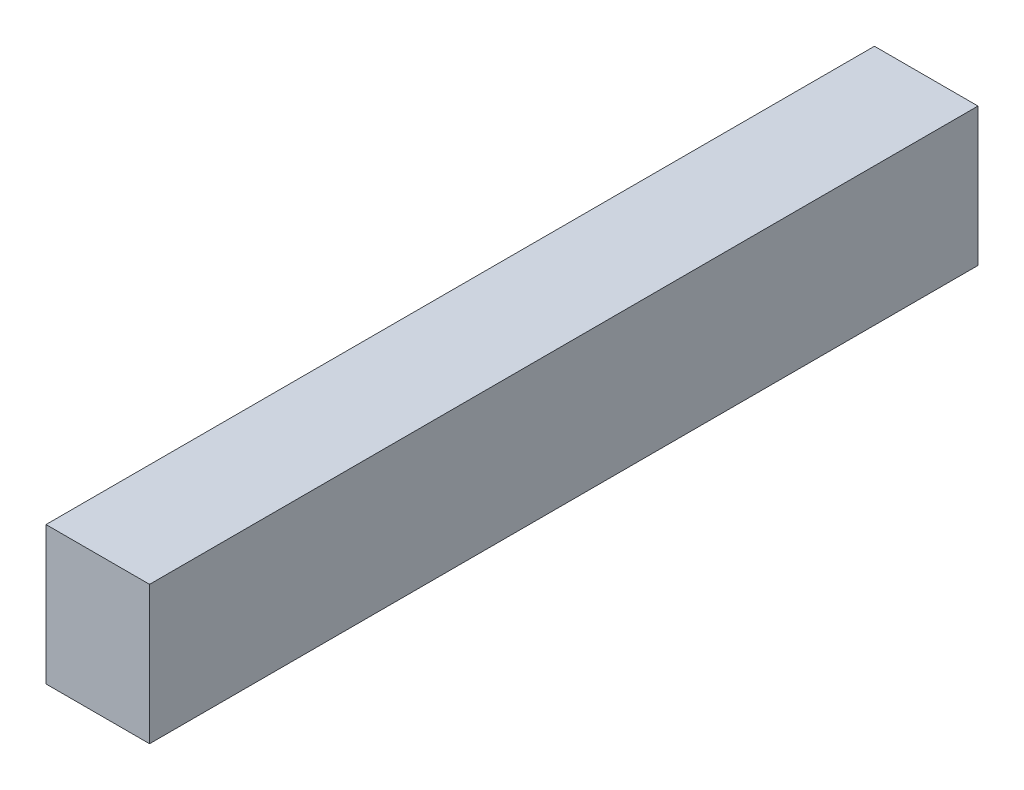
ISO-10303-21;
HEADER;
FILE_DESCRIPTION(('STEP AP214'),'2;1');
FILE_NAME('part.step','',(''),(''),'','','');
FILE_SCHEMA(('AUTOMOTIVE_DESIGN { 1 0 10303 214 1 1 1 1 }'));
ENDSEC;
DATA;
#1=APPLICATION_CONTEXT('core data for automotive mechanical design processes');
#2=APPLICATION_PROTOCOL_DEFINITION('international standard','automotive_design',2000,#1);
#3=PRODUCT_CONTEXT('',#1,'mechanical');
#4=PRODUCT('Part','Part','',(#3));
#5=PRODUCT_RELATED_PRODUCT_CATEGORY('part','',(#4));
#6=PRODUCT_DEFINITION_FORMATION('','',#4);
#7=PRODUCT_DEFINITION_CONTEXT('part definition',#1,'design');
#8=PRODUCT_DEFINITION('design','',#6,#7);
#9=PRODUCT_DEFINITION_SHAPE('','',#8);
#10=(LENGTH_UNIT() NAMED_UNIT(*) SI_UNIT(.MILLI.,.METRE.));
#11=(NAMED_UNIT(*) PLANE_ANGLE_UNIT() SI_UNIT($,.RADIAN.));
#12=(NAMED_UNIT(*) SI_UNIT($,.STERADIAN.) SOLID_ANGLE_UNIT());
#13=UNCERTAINTY_MEASURE_WITH_UNIT(LENGTH_MEASURE(1.E-05),#10,'distance_accuracy_value','');
#14=(GEOMETRIC_REPRESENTATION_CONTEXT(3) GLOBAL_UNCERTAINTY_ASSIGNED_CONTEXT((#13)) GLOBAL_UNIT_ASSIGNED_CONTEXT((#10,
#11,#12)) REPRESENTATION_CONTEXT('',''));
#15=CARTESIAN_POINT('',(0.,0.,0.));
#16=DIRECTION('',(0.,0.,1.));
#17=DIRECTION('',(1.,0.,0.));
#18=AXIS2_PLACEMENT_3D('',#15,#16,#17);
#19=CARTESIAN_POINT('',(-4.20220588235294,5.04264705882352,76.2));
#20=DIRECTION('',(1.,0.,0.));
#21=DIRECTION('',(0.,1.,0.));
#22=AXIS2_PLACEMENT_3D('',#19,#20,#21);
#23=PLANE('',#22);
#24=DIRECTION('',(0.,-1.,0.));
#25=VECTOR('',#24,1.);
#26=CARTESIAN_POINT('',(-4.20220588235294,5.04264705882352,0.));
#27=LINE('',#26,#25);
#28=CARTESIAN_POINT('',(-4.20220588235294,5.04264705882352,0.));
#29=VERTEX_POINT('',#28);
#30=CARTESIAN_POINT('',(-4.20220588235294,-7.65735294117648,0.));
#31=VERTEX_POINT('',#30);
#32=EDGE_CURVE('E99',#29,#31,#27,.T.);
#33=ORIENTED_EDGE('',*,*,#32,.T.);
#34=DIRECTION('',(0.,0.,-1.));
#35=VECTOR('',#34,1.);
#36=CARTESIAN_POINT('',(-4.20220588235294,-7.65735294117648,76.2));
#37=LINE('',#36,#35);
#38=CARTESIAN_POINT('',(-4.20220588235294,-7.65735294117648,76.2));
#39=VERTEX_POINT('',#38);
#40=EDGE_CURVE('E11',#39,#31,#37,.T.);
#41=ORIENTED_EDGE('',*,*,#40,.F.);
#42=DIRECTION('',(0.,-1.,0.));
#43=VECTOR('',#42,1.);
#44=CARTESIAN_POINT('',(-4.20220588235294,5.04264705882352,76.2));
#45=LINE('',#44,#43);
#46=CARTESIAN_POINT('',(-4.20220588235294,5.04264705882352,76.2));
#47=VERTEX_POINT('',#46);
#48=EDGE_CURVE('E87',#47,#39,#45,.T.);
#49=ORIENTED_EDGE('',*,*,#48,.F.);
#50=DIRECTION('',(0.,0.,-1.));
#51=VECTOR('',#50,1.);
#52=CARTESIAN_POINT('',(-4.20220588235294,5.04264705882352,76.2));
#53=LINE('',#52,#51);
#54=EDGE_CURVE('E95',#47,#29,#53,.T.);
#55=ORIENTED_EDGE('',*,*,#54,.T.);
#56=EDGE_LOOP('',(#33,#41,#49,#55));
#57=FACE_BOUND('',#56,.T.);
#58=ADVANCED_FACE('F36',(#57),#23,.F.);
#59=CARTESIAN_POINT('',(-4.20220588235294,-7.65735294117648,76.2));
#60=DIRECTION('',(0.,1.,0.));
#61=DIRECTION('',(0.,0.,1.));
#62=AXIS2_PLACEMENT_3D('',#59,#60,#61);
#63=PLANE('',#62);
#64=DIRECTION('',(1.,0.,0.));
#65=VECTOR('',#64,1.);
#66=CARTESIAN_POINT('',(-4.20220588235294,-7.65735294117648,0.));
#67=LINE('',#66,#65);
#68=CARTESIAN_POINT('',(5.32279411764706,-7.65735294117648,0.));
#69=VERTEX_POINT('',#68);
#70=EDGE_CURVE('E91',#31,#69,#67,.T.);
#71=ORIENTED_EDGE('',*,*,#70,.T.);
#72=DIRECTION('',(0.,0.,-1.));
#73=VECTOR('',#72,1.);
#74=CARTESIAN_POINT('',(5.32279411764706,-7.65735294117648,76.2));
#75=LINE('',#74,#73);
#76=CARTESIAN_POINT('',(5.32279411764706,-7.65735294117648,76.2));
#77=VERTEX_POINT('',#76);
#78=EDGE_CURVE('E44',#77,#69,#75,.T.);
#79=ORIENTED_EDGE('',*,*,#78,.F.);
#80=DIRECTION('',(1.,0.,0.));
#81=VECTOR('',#80,1.);
#82=CARTESIAN_POINT('',(-4.20220588235294,-7.65735294117648,76.2));
#83=LINE('',#82,#81);
#84=EDGE_CURVE('E82',#39,#77,#83,.T.);
#85=ORIENTED_EDGE('',*,*,#84,.F.);
#86=ORIENTED_EDGE('',*,*,#40,.T.);
#87=EDGE_LOOP('',(#71,#79,#85,#86));
#88=FACE_BOUND('',#87,.T.);
#89=ADVANCED_FACE('F90',(#88),#63,.F.);
#90=CARTESIAN_POINT('',(5.32279411764706,5.04264705882352,76.2));
#91=DIRECTION('',(-1.,0.,0.));
#92=DIRECTION('',(0.,-1.,0.));
#93=AXIS2_PLACEMENT_3D('',#90,#91,#92);
#94=PLANE('',#93);
#95=DIRECTION('',(0.,1.,0.));
#96=VECTOR('',#95,1.);
#97=CARTESIAN_POINT('',(5.32279411764706,5.04264705882352,0.));
#98=LINE('',#97,#96);
#99=CARTESIAN_POINT('',(5.32279411764706,5.04264705882352,0.));
#100=VERTEX_POINT('',#99);
#101=EDGE_CURVE('E69',#69,#100,#98,.T.);
#102=ORIENTED_EDGE('',*,*,#101,.T.);
#103=DIRECTION('',(0.,0.,-1.));
#104=VECTOR('',#103,1.);
#105=CARTESIAN_POINT('',(5.32279411764706,5.04264705882352,76.2));
#106=LINE('',#105,#104);
#107=CARTESIAN_POINT('',(5.32279411764706,5.04264705882352,76.2));
#108=VERTEX_POINT('',#107);
#109=EDGE_CURVE('E92',#108,#100,#106,.T.);
#110=ORIENTED_EDGE('',*,*,#109,.F.);
#111=DIRECTION('',(0.,1.,0.));
#112=VECTOR('',#111,1.);
#113=CARTESIAN_POINT('',(5.32279411764706,5.04264705882352,76.2));
#114=LINE('',#113,#112);
#115=EDGE_CURVE('E85',#77,#108,#114,.T.);
#116=ORIENTED_EDGE('',*,*,#115,.F.);
#117=ORIENTED_EDGE('',*,*,#78,.T.);
#118=EDGE_LOOP('',(#102,#110,#116,#117));
#119=FACE_BOUND('',#118,.T.);
#120=ADVANCED_FACE('F93',(#119),#94,.F.);
#121=CARTESIAN_POINT('',(-4.20220588235294,5.04264705882352,76.2));
#122=DIRECTION('',(0.,-1.,0.));
#123=DIRECTION('',(0.,0.,-1.));
#124=AXIS2_PLACEMENT_3D('',#121,#122,#123);
#125=PLANE('',#124);
#126=DIRECTION('',(-1.,0.,0.));
#127=VECTOR('',#126,1.);
#128=CARTESIAN_POINT('',(-4.20220588235294,5.04264705882352,0.));
#129=LINE('',#128,#127);
#130=EDGE_CURVE('E75',#100,#29,#129,.T.);
#131=ORIENTED_EDGE('',*,*,#130,.T.);
#132=ORIENTED_EDGE('',*,*,#54,.F.);
#133=DIRECTION('',(-1.,0.,0.));
#134=VECTOR('',#133,1.);
#135=CARTESIAN_POINT('',(-4.20220588235294,5.04264705882352,76.2));
#136=LINE('',#135,#134);
#137=EDGE_CURVE('E52',#108,#47,#136,.T.);
#138=ORIENTED_EDGE('',*,*,#137,.F.);
#139=ORIENTED_EDGE('',*,*,#109,.T.);
#140=EDGE_LOOP('',(#131,#132,#138,#139));
#141=FACE_BOUND('',#140,.T.);
#142=ADVANCED_FACE('F106',(#141),#125,.F.);
#143=CARTESIAN_POINT('',(0.,0.,76.2));
#144=DIRECTION('',(0.,0.,1.));
#145=DIRECTION('',(1.,0.,0.));
#146=AXIS2_PLACEMENT_3D('',#143,#144,#145);
#147=PLANE('',#146);
#148=ORIENTED_EDGE('',*,*,#48,.T.);
#149=ORIENTED_EDGE('',*,*,#84,.T.);
#150=ORIENTED_EDGE('',*,*,#115,.T.);
#151=ORIENTED_EDGE('',*,*,#137,.T.);
#152=EDGE_LOOP('',(#148,#149,#150,#151));
#153=FACE_BOUND('',#152,.T.);
#154=ADVANCED_FACE('F83',(#153),#147,.T.);
#155=CARTESIAN_POINT('',(0.,0.,0.));
#156=DIRECTION('',(0.,0.,1.));
#157=DIRECTION('',(1.,0.,0.));
#158=AXIS2_PLACEMENT_3D('',#155,#156,#157);
#159=PLANE('',#158);
#160=ORIENTED_EDGE('',*,*,#32,.F.);
#161=ORIENTED_EDGE('',*,*,#130,.F.);
#162=ORIENTED_EDGE('',*,*,#101,.F.);
#163=ORIENTED_EDGE('',*,*,#70,.F.);
#164=EDGE_LOOP('',(#160,#161,#162,#163));
#165=FACE_BOUND('',#164,.T.);
#166=ADVANCED_FACE('F109',(#165),#159,.F.);
#167=CLOSED_SHELL('',(#58,#89,#120,#142,#154,#166));
#168=MANIFOLD_SOLID_BREP('B2',#167);
#169=ADVANCED_BREP_SHAPE_REPRESENTATION('',(#18,#168),#14);
#170=SHAPE_DEFINITION_REPRESENTATION(#9,#169);
ENDSEC;
END-ISO-10303-21;
